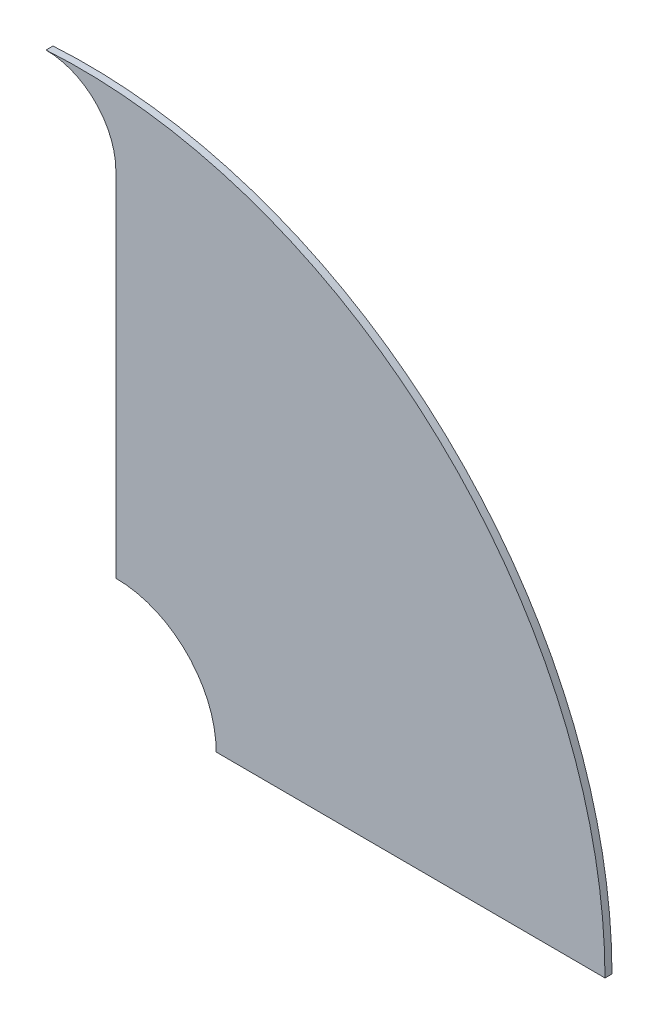
ISO-10303-21;
HEADER;
FILE_DESCRIPTION(('STEP AP214'),'2;1');
FILE_NAME('part.step','',(''),(''),'','','');
FILE_SCHEMA(('AUTOMOTIVE_DESIGN { 1 0 10303 214 1 1 1 1 }'));
ENDSEC;
DATA;
#1=APPLICATION_CONTEXT('core data for automotive mechanical design processes');
#2=APPLICATION_PROTOCOL_DEFINITION('international standard','automotive_design',2000,#1);
#3=PRODUCT_CONTEXT('',#1,'mechanical');
#4=PRODUCT('Part','Part','',(#3));
#5=PRODUCT_RELATED_PRODUCT_CATEGORY('part','',(#4));
#6=PRODUCT_DEFINITION_FORMATION('','',#4);
#7=PRODUCT_DEFINITION_CONTEXT('part definition',#1,'design');
#8=PRODUCT_DEFINITION('design','',#6,#7);
#9=PRODUCT_DEFINITION_SHAPE('','',#8);
#10=(LENGTH_UNIT() NAMED_UNIT(*) SI_UNIT(.MILLI.,.METRE.));
#11=(NAMED_UNIT(*) PLANE_ANGLE_UNIT() SI_UNIT($,.RADIAN.));
#12=(NAMED_UNIT(*) SI_UNIT($,.STERADIAN.) SOLID_ANGLE_UNIT());
#13=UNCERTAINTY_MEASURE_WITH_UNIT(LENGTH_MEASURE(1.E-05),#10,'distance_accuracy_value','');
#14=(GEOMETRIC_REPRESENTATION_CONTEXT(3) GLOBAL_UNCERTAINTY_ASSIGNED_CONTEXT((#13)) GLOBAL_UNIT_ASSIGNED_CONTEXT((#10,
#11,#12)) REPRESENTATION_CONTEXT('',''));
#15=CARTESIAN_POINT('',(0.,0.,0.));
#16=DIRECTION('',(0.,0.,1.));
#17=DIRECTION('',(1.,0.,0.));
#18=AXIS2_PLACEMENT_3D('',#15,#16,#17);
#19=CARTESIAN_POINT('',(946.568769473404,-1260.41644017847,-10.));
#20=DIRECTION('',(0.,0.,1.));
#21=DIRECTION('',(1.,0.,0.));
#22=AXIS2_PLACEMENT_3D('',#19,#20,#21);
#23=CYLINDRICAL_SURFACE('',#22,143.609287145651);
#24=CARTESIAN_POINT('',(946.568769473404,-1260.41644017847,0.));
#25=DIRECTION('',(0.,0.,1.));
#26=DIRECTION('',(1.,0.,0.));
#27=AXIS2_PLACEMENT_3D('',#24,#25,#26);
#28=CIRCLE('',#27,143.609287145651);
#29=CARTESIAN_POINT('',(1090.17805661906,-1260.41644017847,0.));
#30=VERTEX_POINT('',#29);
#31=CARTESIAN_POINT('',(946.568769473404,-1116.80715303282,0.));
#32=VERTEX_POINT('',#31);
#33=EDGE_CURVE('E112',#30,#32,#28,.T.);
#34=ORIENTED_EDGE('',*,*,#33,.T.);
#35=DIRECTION('',(0.,0.,1.));
#36=VECTOR('',#35,1.);
#37=CARTESIAN_POINT('',(946.568769473404,-1116.80715303282,-10.));
#38=LINE('',#37,#36);
#39=CARTESIAN_POINT('',(946.568769473404,-1116.80715303282,-10.));
#40=VERTEX_POINT('',#39);
#41=EDGE_CURVE('E11',#40,#32,#38,.T.);
#42=ORIENTED_EDGE('',*,*,#41,.F.);
#43=CARTESIAN_POINT('',(946.568769473404,-1260.41644017847,-10.));
#44=DIRECTION('',(0.,0.,1.));
#45=DIRECTION('',(1.,0.,0.));
#46=AXIS2_PLACEMENT_3D('',#43,#44,#45);
#47=CIRCLE('',#46,143.609287145651);
#48=CARTESIAN_POINT('',(1090.17805661906,-1260.41644017847,-10.));
#49=VERTEX_POINT('',#48);
#50=EDGE_CURVE('E55',#49,#40,#47,.T.);
#51=ORIENTED_EDGE('',*,*,#50,.F.);
#52=DIRECTION('',(0.,0.,1.));
#53=VECTOR('',#52,1.);
#54=CARTESIAN_POINT('',(1090.17805661906,-1260.41644017847,-10.));
#55=LINE('',#54,#53);
#56=EDGE_CURVE('E40',#49,#30,#55,.T.);
#57=ORIENTED_EDGE('',*,*,#56,.T.);
#58=EDGE_LOOP('',(#34,#42,#51,#57));
#59=FACE_BOUND('',#58,.T.);
#60=ADVANCED_FACE('F37',(#59),#23,.F.);
#61=CARTESIAN_POINT('',(946.568769473404,0.,-10.));
#62=DIRECTION('',(-1.,0.,0.));
#63=DIRECTION('',(0.,0.,1.));
#64=AXIS2_PLACEMENT_3D('',#61,#62,#63);
#65=PLANE('',#64);
#66=DIRECTION('',(0.,-1.,0.));
#67=VECTOR('',#66,1.);
#68=CARTESIAN_POINT('',(946.568769473404,0.,0.));
#69=LINE('',#68,#67);
#70=CARTESIAN_POINT('',(946.568769473404,-612.108653833588,0.));
#71=VERTEX_POINT('',#70);
#72=EDGE_CURVE('E120',#71,#32,#69,.T.);
#73=ORIENTED_EDGE('',*,*,#72,.F.);
#74=DIRECTION('',(0.,0.,1.));
#75=VECTOR('',#74,1.);
#76=CARTESIAN_POINT('',(946.568769473404,-612.108653833588,-10.));
#77=LINE('',#76,#75);
#78=CARTESIAN_POINT('',(946.568769473404,-612.108653833588,-10.));
#79=VERTEX_POINT('',#78);
#80=EDGE_CURVE('E46',#79,#71,#77,.T.);
#81=ORIENTED_EDGE('',*,*,#80,.F.);
#82=DIRECTION('',(0.,-1.,0.));
#83=VECTOR('',#82,1.);
#84=CARTESIAN_POINT('',(946.568769473404,0.,-10.));
#85=LINE('',#84,#83);
#86=EDGE_CURVE('E107',#79,#40,#85,.T.);
#87=ORIENTED_EDGE('',*,*,#86,.T.);
#88=ORIENTED_EDGE('',*,*,#41,.T.);
#89=EDGE_LOOP('',(#73,#81,#87,#88));
#90=FACE_BOUND('',#89,.T.);
#91=ADVANCED_FACE('F136',(#90),#65,.T.);
#92=CARTESIAN_POINT('',(846.568769473404,-612.108653833588,-10.));
#93=DIRECTION('',(0.,0.,1.));
#94=DIRECTION('',(1.,0.,0.));
#95=AXIS2_PLACEMENT_3D('',#92,#93,#94);
#96=CYLINDRICAL_SURFACE('',#95,99.9999999999999);
#97=CARTESIAN_POINT('',(846.568769473404,-612.108653833588,0.));
#98=DIRECTION('',(0.,0.,1.));
#99=DIRECTION('',(1.,0.,0.));
#100=AXIS2_PLACEMENT_3D('',#97,#98,#99);
#101=CIRCLE('',#100,99.9999999999999);
#102=CARTESIAN_POINT('',(846.568769473404,-512.108653833588,0.));
#103=VERTEX_POINT('',#102);
#104=EDGE_CURVE('E95',#103,#71,#101,.F.);
#105=ORIENTED_EDGE('',*,*,#104,.F.);
#106=DIRECTION('',(0.,0.,1.));
#107=VECTOR('',#106,1.);
#108=CARTESIAN_POINT('',(846.568769473404,-512.108653833588,-10.));
#109=LINE('',#108,#107);
#110=CARTESIAN_POINT('',(846.568769473404,-512.108653833588,-10.));
#111=VERTEX_POINT('',#110);
#112=EDGE_CURVE('E90',#111,#103,#109,.T.);
#113=ORIENTED_EDGE('',*,*,#112,.F.);
#114=CARTESIAN_POINT('',(846.568769473404,-612.108653833588,-10.));
#115=DIRECTION('',(0.,0.,1.));
#116=DIRECTION('',(1.,0.,0.));
#117=AXIS2_PLACEMENT_3D('',#114,#115,#116);
#118=CIRCLE('',#117,99.9999999999999);
#119=EDGE_CURVE('E94',#111,#79,#118,.F.);
#120=ORIENTED_EDGE('',*,*,#119,.T.);
#121=ORIENTED_EDGE('',*,*,#80,.T.);
#122=EDGE_LOOP('',(#105,#113,#120,#121));
#123=FACE_BOUND('',#122,.T.);
#124=ADVANCED_FACE('F92',(#123),#96,.F.);
#125=CARTESIAN_POINT('',(894.880365348647,-1262.2429395449,-10.));
#126=DIRECTION('',(0.,0.,1.));
#127=DIRECTION('',(1.,0.,0.));
#128=AXIS2_PLACEMENT_3D('',#125,#126,#127);
#129=CYLINDRICAL_SURFACE('',#128,751.688404124758);
#130=CARTESIAN_POINT('',(894.880365348647,-1262.2429395449,0.));
#131=DIRECTION('',(0.,0.,1.));
#132=DIRECTION('',(1.,0.,0.));
#133=AXIS2_PLACEMENT_3D('',#130,#131,#132);
#134=CIRCLE('',#133,751.688404124758);
#135=CARTESIAN_POINT('',(1646.5687694734,-1262.2429395449,0.));
#136=VERTEX_POINT('',#135);
#137=EDGE_CURVE('E117',#103,#136,#134,.F.);
#138=ORIENTED_EDGE('',*,*,#137,.T.);
#139=DIRECTION('',(0.,0.,1.));
#140=VECTOR('',#139,1.);
#141=CARTESIAN_POINT('',(1646.5687694734,-1262.2429395449,-10.));
#142=LINE('',#141,#140);
#143=CARTESIAN_POINT('',(1646.5687694734,-1262.2429395449,-10.));
#144=VERTEX_POINT('',#143);
#145=EDGE_CURVE('E99',#144,#136,#142,.T.);
#146=ORIENTED_EDGE('',*,*,#145,.F.);
#147=CARTESIAN_POINT('',(894.880365348647,-1262.2429395449,-10.));
#148=DIRECTION('',(0.,0.,1.));
#149=DIRECTION('',(1.,0.,0.));
#150=AXIS2_PLACEMENT_3D('',#147,#148,#149);
#151=CIRCLE('',#150,751.688404124758);
#152=EDGE_CURVE('E102',#111,#144,#151,.F.);
#153=ORIENTED_EDGE('',*,*,#152,.F.);
#154=ORIENTED_EDGE('',*,*,#112,.T.);
#155=EDGE_LOOP('',(#138,#146,#153,#154));
#156=FACE_BOUND('',#155,.T.);
#157=ADVANCED_FACE('F103',(#156),#129,.T.);
#158=CARTESIAN_POINT('',(-4.12585682516717,-1256.8240987565,-10.));
#159=DIRECTION('',(-0.00328274624762553,-0.99999461177402,0.));
#160=DIRECTION('',(0.99999461177402,-0.00328274624762553,0.));
#161=AXIS2_PLACEMENT_3D('',#158,#159,#160);
#162=PLANE('',#161);
#163=DIRECTION('',(0.99999461177402,-0.00328274624762553,0.));
#164=VECTOR('',#163,1.);
#165=CARTESIAN_POINT('',(-4.12585682516717,-1256.8240987565,0.));
#166=LINE('',#165,#164);
#167=EDGE_CURVE('E114',#30,#136,#166,.T.);
#168=ORIENTED_EDGE('',*,*,#167,.F.);
#169=ORIENTED_EDGE('',*,*,#56,.F.);
#170=DIRECTION('',(0.99999461177402,-0.00328274624762553,0.));
#171=VECTOR('',#170,1.);
#172=CARTESIAN_POINT('',(-4.12585682516717,-1256.8240987565,-10.));
#173=LINE('',#172,#171);
#174=EDGE_CURVE('E104',#49,#144,#173,.T.);
#175=ORIENTED_EDGE('',*,*,#174,.T.);
#176=ORIENTED_EDGE('',*,*,#145,.T.);
#177=EDGE_LOOP('',(#168,#169,#175,#176));
#178=FACE_BOUND('',#177,.T.);
#179=ADVANCED_FACE('F127',(#178),#162,.T.);
#180=CARTESIAN_POINT('',(0.,0.,-10.));
#181=DIRECTION('',(0.,0.,1.));
#182=DIRECTION('',(1.,0.,0.));
#183=AXIS2_PLACEMENT_3D('',#180,#181,#182);
#184=PLANE('',#183);
#185=ORIENTED_EDGE('',*,*,#50,.T.);
#186=ORIENTED_EDGE('',*,*,#86,.F.);
#187=ORIENTED_EDGE('',*,*,#119,.F.);
#188=ORIENTED_EDGE('',*,*,#152,.T.);
#189=ORIENTED_EDGE('',*,*,#174,.F.);
#190=EDGE_LOOP('',(#185,#186,#187,#188,#189));
#191=FACE_BOUND('',#190,.T.);
#192=ADVANCED_FACE('F106',(#191),#184,.F.);
#193=CARTESIAN_POINT('',(0.,0.,0.));
#194=DIRECTION('',(0.,0.,1.));
#195=DIRECTION('',(1.,0.,0.));
#196=AXIS2_PLACEMENT_3D('',#193,#194,#195);
#197=PLANE('',#196);
#198=ORIENTED_EDGE('',*,*,#33,.F.);
#199=ORIENTED_EDGE('',*,*,#167,.T.);
#200=ORIENTED_EDGE('',*,*,#137,.F.);
#201=ORIENTED_EDGE('',*,*,#104,.T.);
#202=ORIENTED_EDGE('',*,*,#72,.T.);
#203=EDGE_LOOP('',(#198,#199,#200,#201,#202));
#204=FACE_BOUND('',#203,.T.);
#205=ADVANCED_FACE('F126',(#204),#197,.T.);
#206=CLOSED_SHELL('',(#60,#91,#124,#157,#179,#192,#205));
#207=MANIFOLD_SOLID_BREP('B2',#206);
#208=ADVANCED_BREP_SHAPE_REPRESENTATION('',(#18,#207),#14);
#209=SHAPE_DEFINITION_REPRESENTATION(#9,#208);
ENDSEC;
END-ISO-10303-21;
